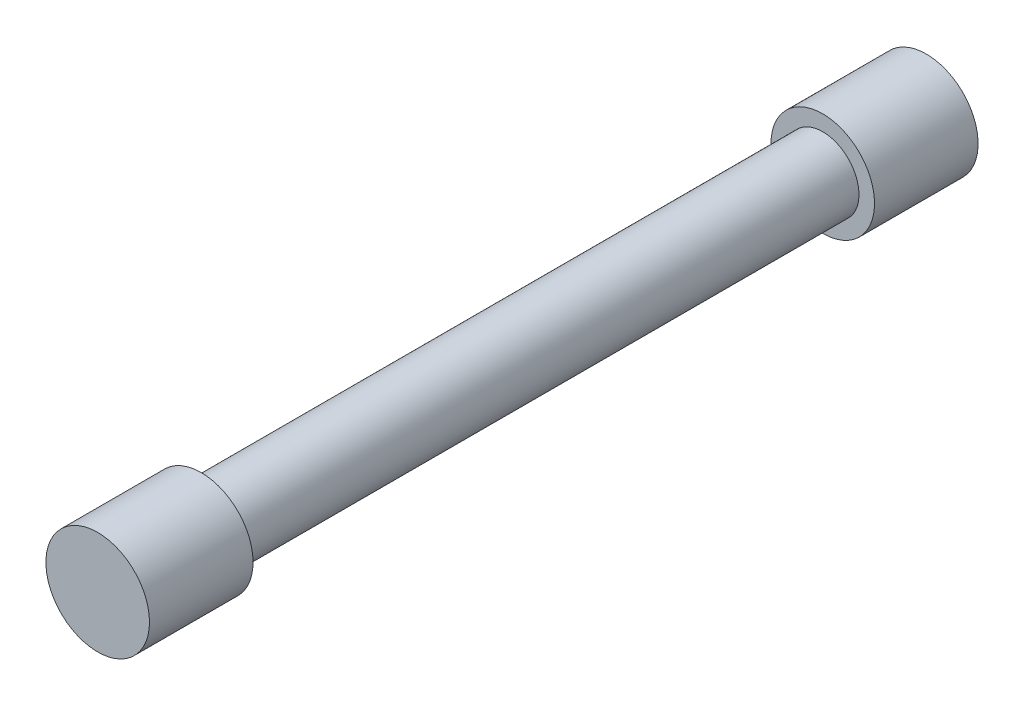
ISO-10303-21;
HEADER;
FILE_DESCRIPTION(('STEP AP214'),'2;1');
FILE_NAME('part.step','',(''),(''),'','','');
FILE_SCHEMA(('AUTOMOTIVE_DESIGN { 1 0 10303 214 1 1 1 1 }'));
ENDSEC;
DATA;
#1=APPLICATION_CONTEXT('core data for automotive mechanical design processes');
#2=APPLICATION_PROTOCOL_DEFINITION('international standard','automotive_design',2000,#1);
#3=PRODUCT_CONTEXT('',#1,'mechanical');
#4=PRODUCT('Part','Part','',(#3));
#5=PRODUCT_RELATED_PRODUCT_CATEGORY('part','',(#4));
#6=PRODUCT_DEFINITION_FORMATION('','',#4);
#7=PRODUCT_DEFINITION_CONTEXT('part definition',#1,'design');
#8=PRODUCT_DEFINITION('design','',#6,#7);
#9=PRODUCT_DEFINITION_SHAPE('','',#8);
#10=(LENGTH_UNIT() NAMED_UNIT(*) SI_UNIT(.MILLI.,.METRE.));
#11=(NAMED_UNIT(*) PLANE_ANGLE_UNIT() SI_UNIT($,.RADIAN.));
#12=(NAMED_UNIT(*) SI_UNIT($,.STERADIAN.) SOLID_ANGLE_UNIT());
#13=UNCERTAINTY_MEASURE_WITH_UNIT(LENGTH_MEASURE(1.E-05),#10,'distance_accuracy_value','');
#14=(GEOMETRIC_REPRESENTATION_CONTEXT(3) GLOBAL_UNCERTAINTY_ASSIGNED_CONTEXT((#13)) GLOBAL_UNIT_ASSIGNED_CONTEXT((#10,
#11,#12)) REPRESENTATION_CONTEXT('',''));
#15=CARTESIAN_POINT('',(0.,0.,0.));
#16=DIRECTION('',(0.,0.,1.));
#17=DIRECTION('',(1.,0.,0.));
#18=AXIS2_PLACEMENT_3D('',#15,#16,#17);
#19=CARTESIAN_POINT('',(0.,0.,38.1));
#20=DIRECTION('',(0.,0.,-1.));
#21=DIRECTION('',(-1.,0.,0.));
#22=AXIS2_PLACEMENT_3D('',#19,#20,#21);
#23=CYLINDRICAL_SURFACE('',#22,2.2225);
#24=CARTESIAN_POINT('',(0.,0.,38.1));
#25=DIRECTION('',(0.,0.,1.));
#26=DIRECTION('',(1.,0.,0.));
#27=AXIS2_PLACEMENT_3D('',#24,#25,#26);
#28=CIRCLE('',#27,2.2225);
#29=CARTESIAN_POINT('',(-2.2225,0.,38.1));
#30=VERTEX_POINT('',#29);
#31=EDGE_CURVE('E10',#30,#30,#28,.T.);
#32=CARTESIAN_POINT('',(0.,0.,0.));
#33=DIRECTION('',(0.,0.,1.));
#34=DIRECTION('',(1.,0.,0.));
#35=AXIS2_PLACEMENT_3D('',#32,#33,#34);
#36=CIRCLE('',#35,2.2225);
#37=CARTESIAN_POINT('',(-2.2225,0.,0.));
#38=VERTEX_POINT('',#37);
#39=EDGE_CURVE('E41',#38,#38,#36,.T.);
#40=CARTESIAN_POINT('',(-2.2225,0.,38.1));
#41=CARTESIAN_POINT('',(-2.2225,0.,37.703125));
#42=CARTESIAN_POINT('',(-2.2225,0.,37.30625));
#43=CARTESIAN_POINT('',(-2.2225,0.,36.5125));
#44=CARTESIAN_POINT('',(-2.2225,0.,36.115625));
#45=CARTESIAN_POINT('',(-2.2225,0.,35.321875));
#46=CARTESIAN_POINT('',(-2.2225,0.,34.925));
#47=CARTESIAN_POINT('',(-2.2225,0.,34.13125));
#48=CARTESIAN_POINT('',(-2.2225,0.,33.734375));
#49=CARTESIAN_POINT('',(-2.2225,0.,32.940625));
#50=CARTESIAN_POINT('',(-2.2225,0.,32.54375));
#51=CARTESIAN_POINT('',(-2.2225,0.,31.75));
#52=CARTESIAN_POINT('',(-2.2225,0.,31.353125));
#53=CARTESIAN_POINT('',(-2.2225,0.,30.559375));
#54=CARTESIAN_POINT('',(-2.2225,0.,30.1625));
#55=CARTESIAN_POINT('',(-2.2225,0.,29.36875));
#56=CARTESIAN_POINT('',(-2.2225,0.,28.971875));
#57=CARTESIAN_POINT('',(-2.2225,0.,28.178125));
#58=CARTESIAN_POINT('',(-2.2225,0.,27.78125));
#59=CARTESIAN_POINT('',(-2.2225,0.,26.9875));
#60=CARTESIAN_POINT('',(-2.2225,0.,26.590625));
#61=CARTESIAN_POINT('',(-2.2225,0.,25.796875));
#62=CARTESIAN_POINT('',(-2.2225,0.,25.4));
#63=CARTESIAN_POINT('',(-2.2225,0.,24.60625));
#64=CARTESIAN_POINT('',(-2.2225,0.,24.209375));
#65=CARTESIAN_POINT('',(-2.2225,0.,23.415625));
#66=CARTESIAN_POINT('',(-2.2225,0.,23.01875));
#67=CARTESIAN_POINT('',(-2.2225,0.,22.225));
#68=CARTESIAN_POINT('',(-2.2225,0.,21.828125));
#69=CARTESIAN_POINT('',(-2.2225,0.,21.034375));
#70=CARTESIAN_POINT('',(-2.2225,0.,20.6375));
#71=CARTESIAN_POINT('',(-2.2225,0.,19.84375));
#72=CARTESIAN_POINT('',(-2.2225,0.,19.446875));
#73=CARTESIAN_POINT('',(-2.2225,0.,18.653125));
#74=CARTESIAN_POINT('',(-2.2225,0.,18.25625));
#75=CARTESIAN_POINT('',(-2.2225,0.,17.4625));
#76=CARTESIAN_POINT('',(-2.2225,0.,17.065625));
#77=CARTESIAN_POINT('',(-2.2225,0.,16.271875));
#78=CARTESIAN_POINT('',(-2.2225,0.,15.875));
#79=CARTESIAN_POINT('',(-2.2225,0.,15.08125));
#80=CARTESIAN_POINT('',(-2.2225,0.,14.684375));
#81=CARTESIAN_POINT('',(-2.2225,0.,13.890625));
#82=CARTESIAN_POINT('',(-2.2225,0.,13.49375));
#83=CARTESIAN_POINT('',(-2.2225,0.,12.7));
#84=CARTESIAN_POINT('',(-2.2225,0.,12.303125));
#85=CARTESIAN_POINT('',(-2.2225,0.,11.509375));
#86=CARTESIAN_POINT('',(-2.2225,0.,11.1125));
#87=CARTESIAN_POINT('',(-2.2225,0.,10.31875));
#88=CARTESIAN_POINT('',(-2.2225,0.,9.92187499999999));
#89=CARTESIAN_POINT('',(-2.2225,0.,9.128125));
#90=CARTESIAN_POINT('',(-2.2225,0.,8.73124999999999));
#91=CARTESIAN_POINT('',(-2.2225,0.,7.93749999999999));
#92=CARTESIAN_POINT('',(-2.2225,0.,7.54062499999999));
#93=CARTESIAN_POINT('',(-2.2225,0.,6.746875));
#94=CARTESIAN_POINT('',(-2.2225,0.,6.35));
#95=CARTESIAN_POINT('',(-2.2225,0.,5.55625));
#96=CARTESIAN_POINT('',(-2.2225,0.,5.159375));
#97=CARTESIAN_POINT('',(-2.2225,0.,4.365625));
#98=CARTESIAN_POINT('',(-2.2225,0.,3.96875));
#99=CARTESIAN_POINT('',(-2.2225,0.,3.175));
#100=CARTESIAN_POINT('',(-2.2225,0.,2.778125));
#101=CARTESIAN_POINT('',(-2.2225,0.,1.984375));
#102=CARTESIAN_POINT('',(-2.2225,0.,1.5875));
#103=CARTESIAN_POINT('',(-2.2225,0.,0.79375));
#104=CARTESIAN_POINT('',(-2.2225,0.,0.396875));
#105=CARTESIAN_POINT('',(-2.2225,0.,0.));
#106=B_SPLINE_CURVE_WITH_KNOTS('',3,(#40,#41,#42,#43,#44,#45,#46,#47,#48,#49,#50,#51,#52,#53,
#54,#55,#56,#57,#58,#59,#60,#61,#62,#63,#64,#65,#66,#67,#68,#69,#70,#71,#72,#73,#74,#75,#76,#77,
#78,#79,#80,#81,#82,#83,#84,#85,#86,#87,#88,#89,#90,#91,#92,#93,#94,#95,#96,#97,#98,#99,#100,
#101,#102,#103,#104,#105),.UNSPECIFIED.,.F.,.F.,(4,2,2,2,2,2,2,2,2,2,2,2,2,2,2,2,2,2,2,2,2,2,2,
2,2,2,2,2,2,2,2,2,4),(0.,1.190625,2.38125,3.571875,4.7625,5.953125,7.14375,8.334375,
9.52500000000001,10.715625,11.90625,13.096875,14.2875,15.478125,16.66875,17.859375,19.05,
20.240625,21.43125,22.621875,23.8125,25.003125,26.19375,27.384375,28.575,29.765625,30.95625,
32.146875,33.3375,34.528125,35.71875,36.909375,38.1),.UNSPECIFIED.);
#107=EDGE_CURVE('BSEAM38',#30,#38,#106,.T.);
#108=ORIENTED_EDGE('',*,*,#31,.F.);
#109=ORIENTED_EDGE('',*,*,#39,.T.);
#110=ORIENTED_EDGE('',*,*,#107,.T.);
#111=ORIENTED_EDGE('',*,*,#107,.F.);
#112=EDGE_LOOP('',(#108,#110,#109,#111));
#113=FACE_BOUND('',#112,.T.);
#114=ADVANCED_FACE('F38',(#113),#23,.T.);
#115=CARTESIAN_POINT('',(0.,0.,-6.35));
#116=DIRECTION('',(0.,0.,1.));
#117=DIRECTION('',(1.,0.,0.));
#118=AXIS2_PLACEMENT_3D('',#115,#116,#117);
#119=CYLINDRICAL_SURFACE('',#118,3.175);
#120=CARTESIAN_POINT('',(0.,0.,-6.35));
#121=DIRECTION('',(0.,0.,-1.));
#122=DIRECTION('',(-1.,0.,0.));
#123=AXIS2_PLACEMENT_3D('',#120,#121,#122);
#124=CIRCLE('',#123,3.175);
#125=CARTESIAN_POINT('',(-3.175,0.,-6.35));
#126=VERTEX_POINT('',#125);
#127=EDGE_CURVE('E48',#126,#126,#124,.T.);
#128=ORIENTED_EDGE('',*,*,#127,.F.);
#129=EDGE_LOOP('',(#128));
#130=FACE_BOUND('',#129,.T.);
#131=CARTESIAN_POINT('',(0.,0.,0.));
#132=DIRECTION('',(0.,0.,-1.));
#133=DIRECTION('',(-1.,0.,0.));
#134=AXIS2_PLACEMENT_3D('',#131,#132,#133);
#135=CIRCLE('',#134,3.175);
#136=CARTESIAN_POINT('',(-3.175,0.,0.));
#137=VERTEX_POINT('',#136);
#138=EDGE_CURVE('E50',#137,#137,#135,.T.);
#139=ORIENTED_EDGE('',*,*,#138,.T.);
#140=EDGE_LOOP('',(#139));
#141=FACE_BOUND('',#140,.T.);
#142=ADVANCED_FACE('F79',(#130,#141),#119,.T.);
#143=CARTESIAN_POINT('',(0.,0.,-6.35));
#144=DIRECTION('',(0.,0.,-1.));
#145=DIRECTION('',(-1.,0.,0.));
#146=AXIS2_PLACEMENT_3D('',#143,#144,#145);
#147=PLANE('',#146);
#148=ORIENTED_EDGE('',*,*,#127,.T.);
#149=EDGE_LOOP('',(#148));
#150=FACE_BOUND('',#149,.T.);
#151=ADVANCED_FACE('F84',(#150),#147,.T.);
#152=CARTESIAN_POINT('',(0.,0.,0.));
#153=DIRECTION('',(0.,0.,-1.));
#154=DIRECTION('',(-1.,0.,0.));
#155=AXIS2_PLACEMENT_3D('',#152,#153,#154);
#156=PLANE('',#155);
#157=ORIENTED_EDGE('',*,*,#39,.F.);
#158=EDGE_LOOP('',(#157));
#159=FACE_BOUND('',#158,.T.);
#160=ORIENTED_EDGE('',*,*,#138,.F.);
#161=EDGE_LOOP('',(#160));
#162=FACE_BOUND('',#161,.T.);
#163=ADVANCED_FACE('F67',(#159,#162),#156,.F.);
#164=CARTESIAN_POINT('',(0.,0.,44.45));
#165=DIRECTION('',(0.,0.,-1.));
#166=DIRECTION('',(-1.,0.,0.));
#167=AXIS2_PLACEMENT_3D('',#164,#165,#166);
#168=CYLINDRICAL_SURFACE('',#167,3.175);
#169=CARTESIAN_POINT('',(0.,0.,44.45));
#170=DIRECTION('',(0.,0.,1.));
#171=DIRECTION('',(1.,0.,0.));
#172=AXIS2_PLACEMENT_3D('',#169,#170,#171);
#173=CIRCLE('',#172,3.175);
#174=CARTESIAN_POINT('',(3.175,0.,44.45));
#175=VERTEX_POINT('',#174);
#176=EDGE_CURVE('E53',#175,#175,#173,.T.);
#177=ORIENTED_EDGE('',*,*,#176,.F.);
#178=EDGE_LOOP('',(#177));
#179=FACE_BOUND('',#178,.T.);
#180=CARTESIAN_POINT('',(0.,0.,38.1));
#181=DIRECTION('',(0.,0.,1.));
#182=DIRECTION('',(1.,0.,0.));
#183=AXIS2_PLACEMENT_3D('',#180,#181,#182);
#184=CIRCLE('',#183,3.175);
#185=CARTESIAN_POINT('',(3.175,0.,38.1));
#186=VERTEX_POINT('',#185);
#187=EDGE_CURVE('E56',#186,#186,#184,.T.);
#188=ORIENTED_EDGE('',*,*,#187,.T.);
#189=EDGE_LOOP('',(#188));
#190=FACE_BOUND('',#189,.T.);
#191=ADVANCED_FACE('F64',(#179,#190),#168,.T.);
#192=CARTESIAN_POINT('',(0.,0.,44.45));
#193=DIRECTION('',(0.,0.,1.));
#194=DIRECTION('',(1.,0.,0.));
#195=AXIS2_PLACEMENT_3D('',#192,#193,#194);
#196=PLANE('',#195);
#197=ORIENTED_EDGE('',*,*,#176,.T.);
#198=EDGE_LOOP('',(#197));
#199=FACE_BOUND('',#198,.T.);
#200=ADVANCED_FACE('F62',(#199),#196,.T.);
#201=CARTESIAN_POINT('',(0.,0.,38.1));
#202=DIRECTION('',(0.,0.,1.));
#203=DIRECTION('',(1.,0.,0.));
#204=AXIS2_PLACEMENT_3D('',#201,#202,#203);
#205=PLANE('',#204);
#206=ORIENTED_EDGE('',*,*,#31,.T.);
#207=EDGE_LOOP('',(#206));
#208=FACE_BOUND('',#207,.T.);
#209=ORIENTED_EDGE('',*,*,#187,.F.);
#210=EDGE_LOOP('',(#209));
#211=FACE_BOUND('',#210,.T.);
#212=ADVANCED_FACE('F71',(#208,#211),#205,.F.);
#213=CLOSED_SHELL('',(#114,#142,#151,#163,#191,#200,#212));
#214=MANIFOLD_SOLID_BREP('B2',#213);
#215=ADVANCED_BREP_SHAPE_REPRESENTATION('',(#18,#214),#14);
#216=SHAPE_DEFINITION_REPRESENTATION(#9,#215);
ENDSEC;
END-ISO-10303-21;
